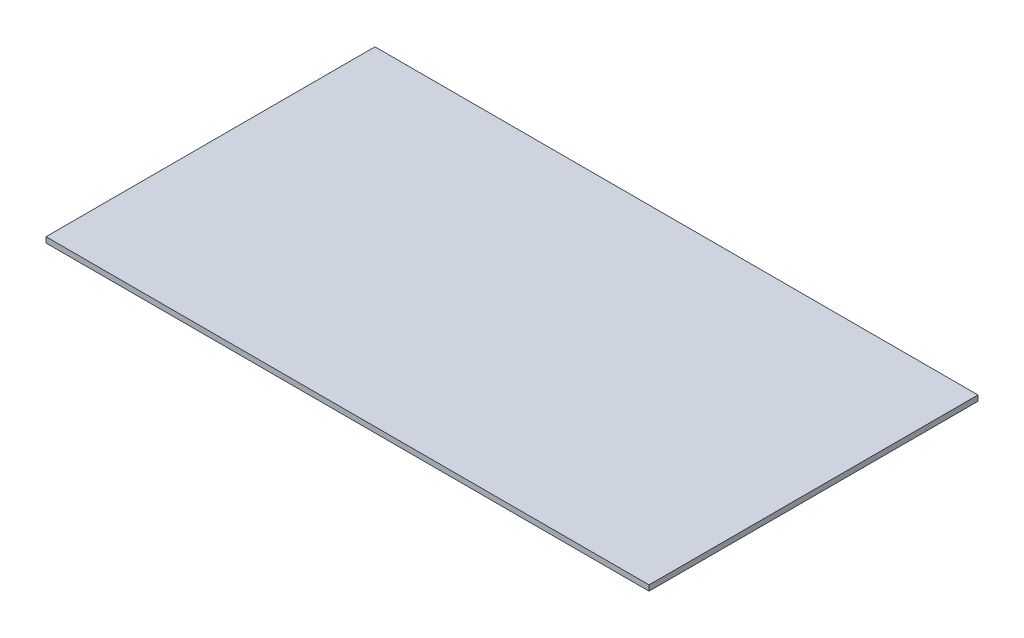
ISO-10303-21;
HEADER;
FILE_DESCRIPTION(('STEP AP214'),'2;1');
FILE_NAME('part.step','',(''),(''),'','','');
FILE_SCHEMA(('AUTOMOTIVE_DESIGN { 1 0 10303 214 1 1 1 1 }'));
ENDSEC;
DATA;
#1=APPLICATION_CONTEXT('core data for automotive mechanical design processes');
#2=APPLICATION_PROTOCOL_DEFINITION('international standard','automotive_design',2000,#1);
#3=PRODUCT_CONTEXT('',#1,'mechanical');
#4=PRODUCT('Part','Part','',(#3));
#5=PRODUCT_RELATED_PRODUCT_CATEGORY('part','',(#4));
#6=PRODUCT_DEFINITION_FORMATION('','',#4);
#7=PRODUCT_DEFINITION_CONTEXT('part definition',#1,'design');
#8=PRODUCT_DEFINITION('design','',#6,#7);
#9=PRODUCT_DEFINITION_SHAPE('','',#8);
#10=(LENGTH_UNIT() NAMED_UNIT(*) SI_UNIT(.MILLI.,.METRE.));
#11=(NAMED_UNIT(*) PLANE_ANGLE_UNIT() SI_UNIT($,.RADIAN.));
#12=(NAMED_UNIT(*) SI_UNIT($,.STERADIAN.) SOLID_ANGLE_UNIT());
#13=UNCERTAINTY_MEASURE_WITH_UNIT(LENGTH_MEASURE(1.E-05),#10,'distance_accuracy_value','');
#14=(GEOMETRIC_REPRESENTATION_CONTEXT(3) GLOBAL_UNCERTAINTY_ASSIGNED_CONTEXT((#13)) GLOBAL_UNIT_ASSIGNED_CONTEXT((#10,
#11,#12)) REPRESENTATION_CONTEXT('',''));
#15=CARTESIAN_POINT('',(0.,0.,0.));
#16=DIRECTION('',(0.,0.,1.));
#17=DIRECTION('',(1.,0.,0.));
#18=AXIS2_PLACEMENT_3D('',#15,#16,#17);
#19=CARTESIAN_POINT('',(275.,5.,-150.));
#20=DIRECTION('',(-1.,0.,0.));
#21=DIRECTION('',(0.,0.,1.));
#22=AXIS2_PLACEMENT_3D('',#19,#20,#21);
#23=PLANE('',#22);
#24=DIRECTION('',(0.,0.,-1.));
#25=VECTOR('',#24,1.);
#26=CARTESIAN_POINT('',(275.,0.,-150.));
#27=LINE('',#26,#25);
#28=CARTESIAN_POINT('',(275.,0.,150.));
#29=VERTEX_POINT('',#28);
#30=CARTESIAN_POINT('',(275.,0.,-150.));
#31=VERTEX_POINT('',#30);
#32=EDGE_CURVE('E107',#29,#31,#27,.T.);
#33=ORIENTED_EDGE('',*,*,#32,.T.);
#34=DIRECTION('',(0.,-1.,0.));
#35=VECTOR('',#34,1.);
#36=CARTESIAN_POINT('',(275.,5.,-150.));
#37=LINE('',#36,#35);
#38=CARTESIAN_POINT('',(275.,5.,-150.));
#39=VERTEX_POINT('',#38);
#40=EDGE_CURVE('E11',#39,#31,#37,.T.);
#41=ORIENTED_EDGE('',*,*,#40,.F.);
#42=DIRECTION('',(0.,0.,-1.));
#43=VECTOR('',#42,1.);
#44=CARTESIAN_POINT('',(275.,5.,-150.));
#45=LINE('',#44,#43);
#46=CARTESIAN_POINT('',(275.,5.,150.));
#47=VERTEX_POINT('',#46);
#48=EDGE_CURVE('E91',#47,#39,#45,.T.);
#49=ORIENTED_EDGE('',*,*,#48,.F.);
#50=DIRECTION('',(0.,-1.,0.));
#51=VECTOR('',#50,1.);
#52=CARTESIAN_POINT('',(275.,5.,150.));
#53=LINE('',#52,#51);
#54=EDGE_CURVE('E103',#47,#29,#53,.T.);
#55=ORIENTED_EDGE('',*,*,#54,.T.);
#56=EDGE_LOOP('',(#33,#41,#49,#55));
#57=FACE_BOUND('',#56,.T.);
#58=ADVANCED_FACE('F39',(#57),#23,.F.);
#59=CARTESIAN_POINT('',(-275.,5.,-150.));
#60=DIRECTION('',(0.,0.,1.));
#61=DIRECTION('',(1.,0.,0.));
#62=AXIS2_PLACEMENT_3D('',#59,#60,#61);
#63=PLANE('',#62);
#64=DIRECTION('',(-1.,0.,0.));
#65=VECTOR('',#64,1.);
#66=CARTESIAN_POINT('',(-275.,0.,-150.));
#67=LINE('',#66,#65);
#68=CARTESIAN_POINT('',(-275.,0.,-150.));
#69=VERTEX_POINT('',#68);
#70=EDGE_CURVE('E96',#31,#69,#67,.T.);
#71=ORIENTED_EDGE('',*,*,#70,.T.);
#72=DIRECTION('',(0.,-1.,0.));
#73=VECTOR('',#72,1.);
#74=CARTESIAN_POINT('',(-275.,5.,-150.));
#75=LINE('',#74,#73);
#76=CARTESIAN_POINT('',(-275.,5.,-150.));
#77=VERTEX_POINT('',#76);
#78=EDGE_CURVE('E48',#77,#69,#75,.T.);
#79=ORIENTED_EDGE('',*,*,#78,.F.);
#80=DIRECTION('',(-1.,0.,0.));
#81=VECTOR('',#80,1.);
#82=CARTESIAN_POINT('',(-275.,5.,-150.));
#83=LINE('',#82,#81);
#84=EDGE_CURVE('E86',#39,#77,#83,.T.);
#85=ORIENTED_EDGE('',*,*,#84,.F.);
#86=ORIENTED_EDGE('',*,*,#40,.T.);
#87=EDGE_LOOP('',(#71,#79,#85,#86));
#88=FACE_BOUND('',#87,.T.);
#89=ADVANCED_FACE('F95',(#88),#63,.F.);
#90=CARTESIAN_POINT('',(-275.,5.,-150.));
#91=DIRECTION('',(1.,0.,0.));
#92=DIRECTION('',(0.,0.,-1.));
#93=AXIS2_PLACEMENT_3D('',#90,#91,#92);
#94=PLANE('',#93);
#95=DIRECTION('',(0.,0.,1.));
#96=VECTOR('',#95,1.);
#97=CARTESIAN_POINT('',(-275.,0.,-150.));
#98=LINE('',#97,#96);
#99=CARTESIAN_POINT('',(-275.,0.,150.));
#100=VERTEX_POINT('',#99);
#101=EDGE_CURVE('E73',#69,#100,#98,.T.);
#102=ORIENTED_EDGE('',*,*,#101,.T.);
#103=DIRECTION('',(0.,-1.,0.));
#104=VECTOR('',#103,1.);
#105=CARTESIAN_POINT('',(-275.,5.,150.));
#106=LINE('',#105,#104);
#107=CARTESIAN_POINT('',(-275.,5.,150.));
#108=VERTEX_POINT('',#107);
#109=EDGE_CURVE('E98',#108,#100,#106,.T.);
#110=ORIENTED_EDGE('',*,*,#109,.F.);
#111=DIRECTION('',(0.,0.,1.));
#112=VECTOR('',#111,1.);
#113=CARTESIAN_POINT('',(-275.,5.,-150.));
#114=LINE('',#113,#112);
#115=EDGE_CURVE('E89',#77,#108,#114,.T.);
#116=ORIENTED_EDGE('',*,*,#115,.F.);
#117=ORIENTED_EDGE('',*,*,#78,.T.);
#118=EDGE_LOOP('',(#102,#110,#116,#117));
#119=FACE_BOUND('',#118,.T.);
#120=ADVANCED_FACE('F99',(#119),#94,.F.);
#121=CARTESIAN_POINT('',(-275.,5.,150.));
#122=DIRECTION('',(0.,0.,-1.));
#123=DIRECTION('',(-1.,0.,0.));
#124=AXIS2_PLACEMENT_3D('',#121,#122,#123);
#125=PLANE('',#124);
#126=DIRECTION('',(1.,0.,0.));
#127=VECTOR('',#126,1.);
#128=CARTESIAN_POINT('',(-275.,0.,150.));
#129=LINE('',#128,#127);
#130=EDGE_CURVE('E79',#100,#29,#129,.T.);
#131=ORIENTED_EDGE('',*,*,#130,.T.);
#132=ORIENTED_EDGE('',*,*,#54,.F.);
#133=DIRECTION('',(1.,0.,0.));
#134=VECTOR('',#133,1.);
#135=CARTESIAN_POINT('',(-275.,5.,150.));
#136=LINE('',#135,#134);
#137=EDGE_CURVE('E56',#108,#47,#136,.T.);
#138=ORIENTED_EDGE('',*,*,#137,.F.);
#139=ORIENTED_EDGE('',*,*,#109,.T.);
#140=EDGE_LOOP('',(#131,#132,#138,#139));
#141=FACE_BOUND('',#140,.T.);
#142=ADVANCED_FACE('F120',(#141),#125,.F.);
#143=CARTESIAN_POINT('',(0.,5.,0.));
#144=DIRECTION('',(0.,1.,0.));
#145=DIRECTION('',(0.,0.,1.));
#146=AXIS2_PLACEMENT_3D('',#143,#144,#145);
#147=PLANE('',#146);
#148=ORIENTED_EDGE('',*,*,#48,.T.);
#149=ORIENTED_EDGE('',*,*,#84,.T.);
#150=ORIENTED_EDGE('',*,*,#115,.T.);
#151=ORIENTED_EDGE('',*,*,#137,.T.);
#152=EDGE_LOOP('',(#148,#149,#150,#151));
#153=FACE_BOUND('',#152,.T.);
#154=ADVANCED_FACE('F87',(#153),#147,.T.);
#155=CARTESIAN_POINT('',(0.,0.,0.));
#156=DIRECTION('',(0.,1.,0.));
#157=DIRECTION('',(0.,0.,1.));
#158=AXIS2_PLACEMENT_3D('',#155,#156,#157);
#159=PLANE('',#158);
#160=ORIENTED_EDGE('',*,*,#32,.F.);
#161=ORIENTED_EDGE('',*,*,#130,.F.);
#162=ORIENTED_EDGE('',*,*,#101,.F.);
#163=ORIENTED_EDGE('',*,*,#70,.F.);
#164=EDGE_LOOP('',(#160,#161,#162,#163));
#165=FACE_BOUND('',#164,.T.);
#166=ADVANCED_FACE('F123',(#165),#159,.F.);
#167=CLOSED_SHELL('',(#58,#89,#120,#142,#154,#166));
#168=MANIFOLD_SOLID_BREP('B2',#167);
#169=ADVANCED_BREP_SHAPE_REPRESENTATION('',(#18,#168),#14);
#170=SHAPE_DEFINITION_REPRESENTATION(#9,#169);
ENDSEC;
END-ISO-10303-21;
